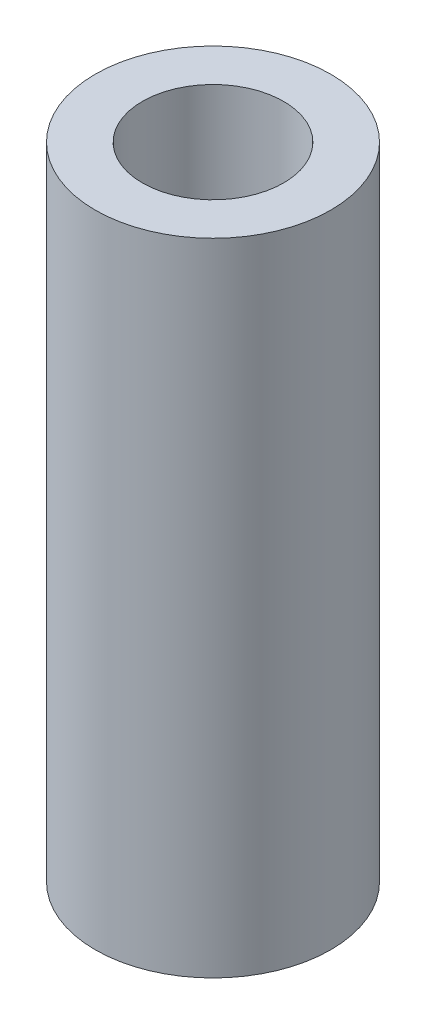
ISO-10303-21;
HEADER;
FILE_DESCRIPTION(('STEP AP214'),'2;1');
FILE_NAME('part.step','',(''),(''),'','','');
FILE_SCHEMA(('AUTOMOTIVE_DESIGN { 1 0 10303 214 1 1 1 1 }'));
ENDSEC;
DATA;
#1=APPLICATION_CONTEXT('core data for automotive mechanical design processes');
#2=APPLICATION_PROTOCOL_DEFINITION('international standard','automotive_design',2000,#1);
#3=PRODUCT_CONTEXT('',#1,'mechanical');
#4=PRODUCT('Part','Part','',(#3));
#5=PRODUCT_RELATED_PRODUCT_CATEGORY('part','',(#4));
#6=PRODUCT_DEFINITION_FORMATION('','',#4);
#7=PRODUCT_DEFINITION_CONTEXT('part definition',#1,'design');
#8=PRODUCT_DEFINITION('design','',#6,#7);
#9=PRODUCT_DEFINITION_SHAPE('','',#8);
#10=(LENGTH_UNIT() NAMED_UNIT(*) SI_UNIT(.MILLI.,.METRE.));
#11=(NAMED_UNIT(*) PLANE_ANGLE_UNIT() SI_UNIT($,.RADIAN.));
#12=(NAMED_UNIT(*) SI_UNIT($,.STERADIAN.) SOLID_ANGLE_UNIT());
#13=UNCERTAINTY_MEASURE_WITH_UNIT(LENGTH_MEASURE(1.E-05),#10,'distance_accuracy_value','');
#14=(GEOMETRIC_REPRESENTATION_CONTEXT(3) GLOBAL_UNCERTAINTY_ASSIGNED_CONTEXT((#13)) GLOBAL_UNIT_ASSIGNED_CONTEXT((#10,
#11,#12)) REPRESENTATION_CONTEXT('',''));
#15=CARTESIAN_POINT('',(0.,0.,0.));
#16=DIRECTION('',(0.,0.,1.));
#17=DIRECTION('',(1.,0.,0.));
#18=AXIS2_PLACEMENT_3D('',#15,#16,#17);
#19=CARTESIAN_POINT('',(0.,34.544,0.));
#20=DIRECTION('',(0.,1.,0.));
#21=DIRECTION('',(0.,0.,1.));
#22=AXIS2_PLACEMENT_3D('',#19,#20,#21);
#23=PLANE('',#22);
#24=CARTESIAN_POINT('',(0.,34.544,0.));
#25=DIRECTION('',(0.,1.,0.));
#26=DIRECTION('',(0.,0.,1.));
#27=AXIS2_PLACEMENT_3D('',#24,#25,#26);
#28=CIRCLE('',#27,6.35);
#29=CARTESIAN_POINT('',(0.,34.544,6.35));
#30=VERTEX_POINT('',#29);
#31=EDGE_CURVE('E10',#30,#30,#28,.T.);
#32=ORIENTED_EDGE('',*,*,#31,.T.);
#33=EDGE_LOOP('',(#32));
#34=FACE_BOUND('',#33,.T.);
#35=CARTESIAN_POINT('',(0.,34.544,0.));
#36=DIRECTION('',(0.,1.,0.));
#37=DIRECTION('',(0.,0.,1.));
#38=AXIS2_PLACEMENT_3D('',#35,#36,#37);
#39=CIRCLE('',#38,3.81);
#40=CARTESIAN_POINT('',(0.,34.544,3.81));
#41=VERTEX_POINT('',#40);
#42=EDGE_CURVE('E54',#41,#41,#39,.T.);
#43=ORIENTED_EDGE('',*,*,#42,.F.);
#44=EDGE_LOOP('',(#43));
#45=FACE_BOUND('',#44,.T.);
#46=ADVANCED_FACE('F41',(#34,#45),#23,.T.);
#47=CARTESIAN_POINT('',(0.,0.,0.));
#48=DIRECTION('',(0.,1.,0.));
#49=DIRECTION('',(0.,0.,1.));
#50=AXIS2_PLACEMENT_3D('',#47,#48,#49);
#51=PLANE('',#50);
#52=CARTESIAN_POINT('',(0.,0.,0.));
#53=DIRECTION('',(0.,1.,0.));
#54=DIRECTION('',(0.,0.,1.));
#55=AXIS2_PLACEMENT_3D('',#52,#53,#54);
#56=CIRCLE('',#55,6.35);
#57=CARTESIAN_POINT('',(0.,0.,6.35));
#58=VERTEX_POINT('',#57);
#59=EDGE_CURVE('E45',#58,#58,#56,.T.);
#60=ORIENTED_EDGE('',*,*,#59,.F.);
#61=EDGE_LOOP('',(#60));
#62=FACE_BOUND('',#61,.T.);
#63=CARTESIAN_POINT('',(0.,0.,0.));
#64=DIRECTION('',(0.,1.,0.));
#65=DIRECTION('',(0.,0.,1.));
#66=AXIS2_PLACEMENT_3D('',#63,#64,#65);
#67=CIRCLE('',#66,3.81);
#68=CARTESIAN_POINT('',(0.,0.,3.81));
#69=VERTEX_POINT('',#68);
#70=EDGE_CURVE('E56',#69,#69,#67,.T.);
#71=ORIENTED_EDGE('',*,*,#70,.T.);
#72=EDGE_LOOP('',(#71));
#73=FACE_BOUND('',#72,.T.);
#74=ADVANCED_FACE('F68',(#62,#73),#51,.F.);
#75=CARTESIAN_POINT('',(0.,34.544,0.));
#76=DIRECTION('',(0.,-1.,0.));
#77=DIRECTION('',(0.,0.,-1.));
#78=AXIS2_PLACEMENT_3D('',#75,#76,#77);
#79=CYLINDRICAL_SURFACE('',#78,6.35);
#80=ORIENTED_EDGE('',*,*,#31,.F.);
#81=EDGE_LOOP('',(#80));
#82=FACE_BOUND('',#81,.T.);
#83=ORIENTED_EDGE('',*,*,#59,.T.);
#84=EDGE_LOOP('',(#83));
#85=FACE_BOUND('',#84,.T.);
#86=ADVANCED_FACE('F43',(#82,#85),#79,.T.);
#87=CARTESIAN_POINT('',(0.,34.544,0.));
#88=DIRECTION('',(0.,-1.,0.));
#89=DIRECTION('',(0.,0.,-1.));
#90=AXIS2_PLACEMENT_3D('',#87,#88,#89);
#91=CYLINDRICAL_SURFACE('',#90,3.81);
#92=ORIENTED_EDGE('',*,*,#42,.T.);
#93=EDGE_LOOP('',(#92));
#94=FACE_BOUND('',#93,.T.);
#95=ORIENTED_EDGE('',*,*,#70,.F.);
#96=EDGE_LOOP('',(#95));
#97=FACE_BOUND('',#96,.T.);
#98=ADVANCED_FACE('F64',(#94,#97),#91,.F.);
#99=CLOSED_SHELL('',(#46,#74,#86,#98));
#100=MANIFOLD_SOLID_BREP('B2',#99);
#101=ADVANCED_BREP_SHAPE_REPRESENTATION('',(#18,#100),#14);
#102=SHAPE_DEFINITION_REPRESENTATION(#9,#101);
ENDSEC;
END-ISO-10303-21;
